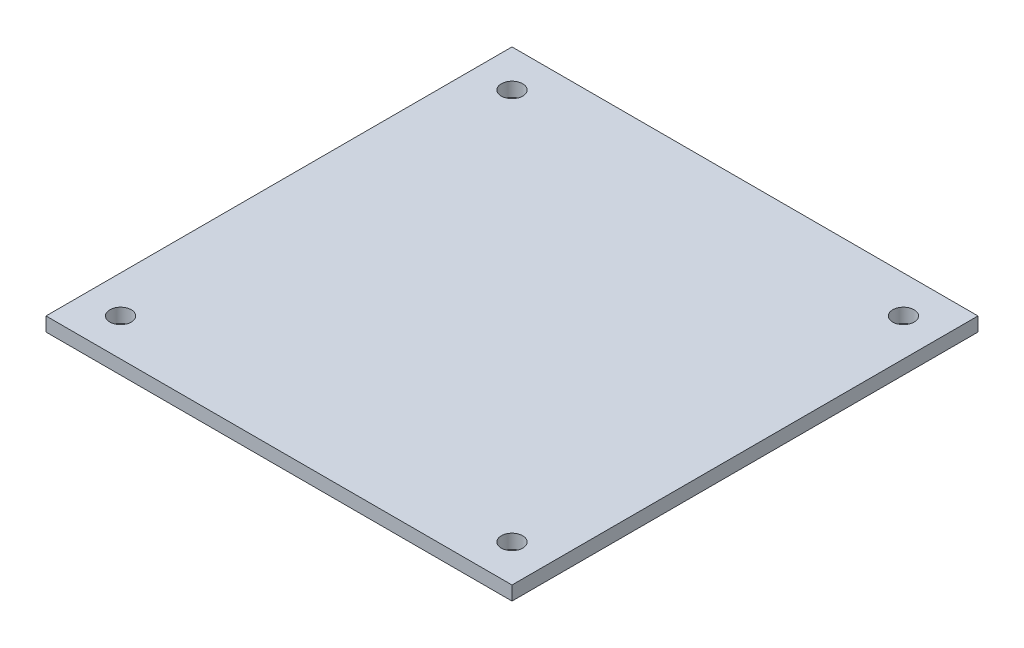
ISO-10303-21;
HEADER;
FILE_DESCRIPTION(('STEP AP214'),'2;1');
FILE_NAME('part.step','',(''),(''),'','','');
FILE_SCHEMA(('AUTOMOTIVE_DESIGN { 1 0 10303 214 1 1 1 1 }'));
ENDSEC;
DATA;
#1=APPLICATION_CONTEXT('core data for automotive mechanical design processes');
#2=APPLICATION_PROTOCOL_DEFINITION('international standard','automotive_design',2000,#1);
#3=PRODUCT_CONTEXT('',#1,'mechanical');
#4=PRODUCT('Part','Part','',(#3));
#5=PRODUCT_RELATED_PRODUCT_CATEGORY('part','',(#4));
#6=PRODUCT_DEFINITION_FORMATION('','',#4);
#7=PRODUCT_DEFINITION_CONTEXT('part definition',#1,'design');
#8=PRODUCT_DEFINITION('design','',#6,#7);
#9=PRODUCT_DEFINITION_SHAPE('','',#8);
#10=(LENGTH_UNIT() NAMED_UNIT(*) SI_UNIT(.MILLI.,.METRE.));
#11=(NAMED_UNIT(*) PLANE_ANGLE_UNIT() SI_UNIT($,.RADIAN.));
#12=(NAMED_UNIT(*) SI_UNIT($,.STERADIAN.) SOLID_ANGLE_UNIT());
#13=UNCERTAINTY_MEASURE_WITH_UNIT(LENGTH_MEASURE(1.E-05),#10,'distance_accuracy_value','');
#14=(GEOMETRIC_REPRESENTATION_CONTEXT(3) GLOBAL_UNCERTAINTY_ASSIGNED_CONTEXT((#13)) GLOBAL_UNIT_ASSIGNED_CONTEXT((#10,
#11,#12)) REPRESENTATION_CONTEXT('',''));
#15=CARTESIAN_POINT('',(0.,0.,0.));
#16=DIRECTION('',(0.,0.,1.));
#17=DIRECTION('',(1.,0.,0.));
#18=AXIS2_PLACEMENT_3D('',#15,#16,#17);
#19=CARTESIAN_POINT('',(-49.8904090638348,1.5,-45.5515423866643));
#20=DIRECTION('',(0.,0.,-1.));
#21=DIRECTION('',(-1.,0.,0.));
#22=AXIS2_PLACEMENT_3D('',#19,#20,#21);
#23=PLANE('',#22);
#24=DIRECTION('',(1.,0.,0.));
#25=VECTOR('',#24,1.);
#26=CARTESIAN_POINT('',(-49.8904090638348,0.,-45.5515423866643));
#27=LINE('',#26,#25);
#28=CARTESIAN_POINT('',(-49.8904090638348,0.,-45.5515423866643));
#29=VERTEX_POINT('',#28);
#30=CARTESIAN_POINT('',(0.109590936165201,0.,-45.5515423866643));
#31=VERTEX_POINT('',#30);
#32=EDGE_CURVE('E101',#29,#31,#27,.T.);
#33=ORIENTED_EDGE('',*,*,#32,.F.);
#34=DIRECTION('',(0.,-1.,0.));
#35=VECTOR('',#34,1.);
#36=CARTESIAN_POINT('',(-49.8904090638348,1.5,-45.5515423866643));
#37=LINE('',#36,#35);
#38=CARTESIAN_POINT('',(-49.8904090638348,1.5,-45.5515423866643));
#39=VERTEX_POINT('',#38);
#40=EDGE_CURVE('E11',#39,#29,#37,.T.);
#41=ORIENTED_EDGE('',*,*,#40,.F.);
#42=DIRECTION('',(1.,0.,0.));
#43=VECTOR('',#42,1.);
#44=CARTESIAN_POINT('',(-49.8904090638348,1.5,-45.5515423866643));
#45=LINE('',#44,#43);
#46=CARTESIAN_POINT('',(0.109590936165201,1.5,-45.5515423866643));
#47=VERTEX_POINT('',#46);
#48=EDGE_CURVE('E95',#39,#47,#45,.T.);
#49=ORIENTED_EDGE('',*,*,#48,.T.);
#50=DIRECTION('',(0.,-1.,0.));
#51=VECTOR('',#50,1.);
#52=CARTESIAN_POINT('',(0.109590936165201,1.5,-45.5515423866643));
#53=LINE('',#52,#51);
#54=EDGE_CURVE('E38',#47,#31,#53,.T.);
#55=ORIENTED_EDGE('',*,*,#54,.T.);
#56=EDGE_LOOP('',(#33,#41,#49,#55));
#57=FACE_BOUND('',#56,.T.);
#58=ADVANCED_FACE('F35',(#57),#23,.T.);
#59=CARTESIAN_POINT('',(-49.8904090638348,1.5,-45.5515423866643));
#60=DIRECTION('',(1.,0.,0.));
#61=DIRECTION('',(0.,0.,-1.));
#62=AXIS2_PLACEMENT_3D('',#59,#60,#61);
#63=PLANE('',#62);
#64=DIRECTION('',(0.,0.,1.));
#65=VECTOR('',#64,1.);
#66=CARTESIAN_POINT('',(-49.8904090638348,0.,-45.5515423866643));
#67=LINE('',#66,#65);
#68=CARTESIAN_POINT('',(-49.8904090638348,0.,4.44845761333568));
#69=VERTEX_POINT('',#68);
#70=EDGE_CURVE('E68',#29,#69,#67,.T.);
#71=ORIENTED_EDGE('',*,*,#70,.T.);
#72=DIRECTION('',(0.,-1.,0.));
#73=VECTOR('',#72,1.);
#74=CARTESIAN_POINT('',(-49.8904090638348,1.5,4.44845761333568));
#75=LINE('',#74,#73);
#76=CARTESIAN_POINT('',(-49.8904090638348,1.5,4.44845761333568));
#77=VERTEX_POINT('',#76);
#78=EDGE_CURVE('E44',#77,#69,#75,.T.);
#79=ORIENTED_EDGE('',*,*,#78,.F.);
#80=DIRECTION('',(0.,0.,1.));
#81=VECTOR('',#80,1.);
#82=CARTESIAN_POINT('',(-49.8904090638348,1.5,-45.5515423866643));
#83=LINE('',#82,#81);
#84=EDGE_CURVE('E85',#39,#77,#83,.T.);
#85=ORIENTED_EDGE('',*,*,#84,.F.);
#86=ORIENTED_EDGE('',*,*,#40,.T.);
#87=EDGE_LOOP('',(#71,#79,#85,#86));
#88=FACE_BOUND('',#87,.T.);
#89=ADVANCED_FACE('F112',(#88),#63,.F.);
#90=CARTESIAN_POINT('',(-49.8904090638348,1.5,4.44845761333568));
#91=DIRECTION('',(0.,0.,-1.));
#92=DIRECTION('',(-1.,0.,0.));
#93=AXIS2_PLACEMENT_3D('',#90,#91,#92);
#94=PLANE('',#93);
#95=DIRECTION('',(1.,0.,0.));
#96=VECTOR('',#95,1.);
#97=CARTESIAN_POINT('',(-49.8904090638348,0.,4.44845761333568));
#98=LINE('',#97,#96);
#99=CARTESIAN_POINT('',(0.109590936165208,0.,4.44845761333568));
#100=VERTEX_POINT('',#99);
#101=EDGE_CURVE('E92',#69,#100,#98,.T.);
#102=ORIENTED_EDGE('',*,*,#101,.T.);
#103=DIRECTION('',(0.,-1.,0.));
#104=VECTOR('',#103,1.);
#105=CARTESIAN_POINT('',(0.109590936165208,1.5,4.44845761333568));
#106=LINE('',#105,#104);
#107=CARTESIAN_POINT('',(0.109590936165208,1.5,4.44845761333568));
#108=VERTEX_POINT('',#107);
#109=EDGE_CURVE('E89',#108,#100,#106,.T.);
#110=ORIENTED_EDGE('',*,*,#109,.F.);
#111=DIRECTION('',(1.,0.,0.));
#112=VECTOR('',#111,1.);
#113=CARTESIAN_POINT('',(-49.8904090638348,1.5,4.44845761333568));
#114=LINE('',#113,#112);
#115=EDGE_CURVE('E80',#77,#108,#114,.T.);
#116=ORIENTED_EDGE('',*,*,#115,.F.);
#117=ORIENTED_EDGE('',*,*,#78,.T.);
#118=EDGE_LOOP('',(#102,#110,#116,#117));
#119=FACE_BOUND('',#118,.T.);
#120=ADVANCED_FACE('F90',(#119),#94,.F.);
#121=CARTESIAN_POINT('',(0.109590936165201,1.5,-45.5515423866643));
#122=DIRECTION('',(1.,0.,0.));
#123=DIRECTION('',(0.,0.,-1.));
#124=AXIS2_PLACEMENT_3D('',#121,#122,#123);
#125=PLANE('',#124);
#126=DIRECTION('',(0.,0.,1.));
#127=VECTOR('',#126,1.);
#128=CARTESIAN_POINT('',(0.109590936165201,0.,-45.5515423866643));
#129=LINE('',#128,#127);
#130=EDGE_CURVE('E104',#31,#100,#129,.T.);
#131=ORIENTED_EDGE('',*,*,#130,.F.);
#132=ORIENTED_EDGE('',*,*,#54,.F.);
#133=DIRECTION('',(0.,0.,1.));
#134=VECTOR('',#133,1.);
#135=CARTESIAN_POINT('',(0.109590936165201,1.5,-45.5515423866643));
#136=LINE('',#135,#134);
#137=EDGE_CURVE('E84',#47,#108,#136,.T.);
#138=ORIENTED_EDGE('',*,*,#137,.T.);
#139=ORIENTED_EDGE('',*,*,#109,.T.);
#140=EDGE_LOOP('',(#131,#132,#138,#139));
#141=FACE_BOUND('',#140,.T.);
#142=ADVANCED_FACE('F94',(#141),#125,.T.);
#143=CARTESIAN_POINT('',(0.,1.5,0.));
#144=DIRECTION('',(0.,-1.,0.));
#145=DIRECTION('',(0.,0.,-1.));
#146=AXIS2_PLACEMENT_3D('',#143,#144,#145);
#147=PLANE('',#146);
#148=CARTESIAN_POINT('',(-3.8904090638348,1.5,-41.5515423866643));
#149=DIRECTION('',(0.,1.,0.));
#150=DIRECTION('',(0.,0.,1.));
#151=AXIS2_PLACEMENT_3D('',#148,#149,#150);
#152=CIRCLE('',#151,1.15);
#153=CARTESIAN_POINT('',(-3.8904090638348,1.5,-40.4015423866643));
#154=VERTEX_POINT('',#153);
#155=EDGE_CURVE('E173',#154,#154,#152,.T.);
#156=ORIENTED_EDGE('',*,*,#155,.F.);
#157=EDGE_LOOP('',(#156));
#158=FACE_BOUND('',#157,.T.);
#159=CARTESIAN_POINT('',(-45.8904090638348,1.5,-41.5515423866643));
#160=DIRECTION('',(0.,1.,0.));
#161=DIRECTION('',(0.,0.,1.));
#162=AXIS2_PLACEMENT_3D('',#159,#160,#161);
#163=CIRCLE('',#162,1.15);
#164=CARTESIAN_POINT('',(-45.8904090638348,1.5,-40.4015423866643));
#165=VERTEX_POINT('',#164);
#166=EDGE_CURVE('E165',#165,#165,#163,.T.);
#167=ORIENTED_EDGE('',*,*,#166,.F.);
#168=EDGE_LOOP('',(#167));
#169=FACE_BOUND('',#168,.T.);
#170=CARTESIAN_POINT('',(-45.8904090638348,1.5,0.448457613335673));
#171=DIRECTION('',(0.,1.,0.));
#172=DIRECTION('',(0.,0.,1.));
#173=AXIS2_PLACEMENT_3D('',#170,#171,#172);
#174=CIRCLE('',#173,1.15);
#175=CARTESIAN_POINT('',(-45.8904090638348,1.5,1.59845761333567));
#176=VERTEX_POINT('',#175);
#177=EDGE_CURVE('E158',#176,#176,#174,.T.);
#178=ORIENTED_EDGE('',*,*,#177,.F.);
#179=EDGE_LOOP('',(#178));
#180=FACE_BOUND('',#179,.T.);
#181=CARTESIAN_POINT('',(-3.8904090638348,1.5,0.448457613335673));
#182=DIRECTION('',(0.,1.,0.));
#183=DIRECTION('',(0.,0.,1.));
#184=AXIS2_PLACEMENT_3D('',#181,#182,#183);
#185=CIRCLE('',#184,1.15);
#186=CARTESIAN_POINT('',(-3.8904090638348,1.5,1.59845761333567));
#187=VERTEX_POINT('',#186);
#188=EDGE_CURVE('E162',#187,#187,#185,.T.);
#189=ORIENTED_EDGE('',*,*,#188,.F.);
#190=EDGE_LOOP('',(#189));
#191=FACE_BOUND('',#190,.T.);
#192=ORIENTED_EDGE('',*,*,#48,.F.);
#193=ORIENTED_EDGE('',*,*,#84,.T.);
#194=ORIENTED_EDGE('',*,*,#115,.T.);
#195=ORIENTED_EDGE('',*,*,#137,.F.);
#196=EDGE_LOOP('',(#192,#193,#194,#195));
#197=FACE_BOUND('',#196,.T.);
#198=ADVANCED_FACE('F83',(#158,#169,#180,#191,#197),#147,.F.);
#199=CARTESIAN_POINT('',(0.,0.,0.));
#200=DIRECTION('',(0.,-1.,0.));
#201=DIRECTION('',(0.,0.,-1.));
#202=AXIS2_PLACEMENT_3D('',#199,#200,#201);
#203=PLANE('',#202);
#204=CARTESIAN_POINT('',(-3.8904090638348,0.,-41.5515423866643));
#205=DIRECTION('',(0.,1.,0.));
#206=DIRECTION('',(0.,0.,1.));
#207=AXIS2_PLACEMENT_3D('',#204,#205,#206);
#208=CIRCLE('',#207,1.15);
#209=CARTESIAN_POINT('',(-3.8904090638348,0.,-40.4015423866643));
#210=VERTEX_POINT('',#209);
#211=EDGE_CURVE('E170',#210,#210,#208,.T.);
#212=ORIENTED_EDGE('',*,*,#211,.T.);
#213=EDGE_LOOP('',(#212));
#214=FACE_BOUND('',#213,.T.);
#215=CARTESIAN_POINT('',(-45.8904090638348,0.,-41.5515423866643));
#216=DIRECTION('',(0.,1.,0.));
#217=DIRECTION('',(0.,0.,1.));
#218=AXIS2_PLACEMENT_3D('',#215,#216,#217);
#219=CIRCLE('',#218,1.15);
#220=CARTESIAN_POINT('',(-45.8904090638348,0.,-40.4015423866643));
#221=VERTEX_POINT('',#220);
#222=EDGE_CURVE('E160',#221,#221,#219,.T.);
#223=ORIENTED_EDGE('',*,*,#222,.T.);
#224=EDGE_LOOP('',(#223));
#225=FACE_BOUND('',#224,.T.);
#226=CARTESIAN_POINT('',(-45.8904090638348,0.,0.448457613335673));
#227=DIRECTION('',(0.,1.,0.));
#228=DIRECTION('',(0.,0.,1.));
#229=AXIS2_PLACEMENT_3D('',#226,#227,#228);
#230=CIRCLE('',#229,1.15);
#231=CARTESIAN_POINT('',(-45.8904090638348,0.,1.59845761333567));
#232=VERTEX_POINT('',#231);
#233=EDGE_CURVE('E155',#232,#232,#230,.T.);
#234=ORIENTED_EDGE('',*,*,#233,.T.);
#235=EDGE_LOOP('',(#234));
#236=FACE_BOUND('',#235,.T.);
#237=CARTESIAN_POINT('',(-3.8904090638348,0.,0.448457613335673));
#238=DIRECTION('',(0.,1.,0.));
#239=DIRECTION('',(0.,0.,1.));
#240=AXIS2_PLACEMENT_3D('',#237,#238,#239);
#241=CIRCLE('',#240,1.15);
#242=CARTESIAN_POINT('',(-3.8904090638348,0.,1.59845761333567));
#243=VERTEX_POINT('',#242);
#244=EDGE_CURVE('E105',#243,#243,#241,.T.);
#245=ORIENTED_EDGE('',*,*,#244,.T.);
#246=EDGE_LOOP('',(#245));
#247=FACE_BOUND('',#246,.T.);
#248=ORIENTED_EDGE('',*,*,#32,.T.);
#249=ORIENTED_EDGE('',*,*,#130,.T.);
#250=ORIENTED_EDGE('',*,*,#101,.F.);
#251=ORIENTED_EDGE('',*,*,#70,.F.);
#252=EDGE_LOOP('',(#248,#249,#250,#251));
#253=FACE_BOUND('',#252,.T.);
#254=ADVANCED_FACE('F110',(#214,#225,#236,#247,#253),#203,.T.);
#255=CARTESIAN_POINT('',(-3.8904090638348,0.,0.448457613335673));
#256=DIRECTION('',(0.,1.,0.));
#257=DIRECTION('',(0.,0.,1.));
#258=AXIS2_PLACEMENT_3D('',#255,#256,#257);
#259=CYLINDRICAL_SURFACE('',#258,1.15);
#260=ORIENTED_EDGE('',*,*,#244,.F.);
#261=EDGE_LOOP('',(#260));
#262=FACE_BOUND('',#261,.T.);
#263=ORIENTED_EDGE('',*,*,#188,.T.);
#264=EDGE_LOOP('',(#263));
#265=FACE_BOUND('',#264,.T.);
#266=ADVANCED_FACE('F131',(#262,#265),#259,.F.);
#267=CARTESIAN_POINT('',(-45.8904090638348,0.,0.448457613335673));
#268=DIRECTION('',(0.,1.,0.));
#269=DIRECTION('',(0.,0.,1.));
#270=AXIS2_PLACEMENT_3D('',#267,#268,#269);
#271=CYLINDRICAL_SURFACE('',#270,1.15);
#272=ORIENTED_EDGE('',*,*,#233,.F.);
#273=EDGE_LOOP('',(#272));
#274=FACE_BOUND('',#273,.T.);
#275=ORIENTED_EDGE('',*,*,#177,.T.);
#276=EDGE_LOOP('',(#275));
#277=FACE_BOUND('',#276,.T.);
#278=ADVANCED_FACE('F138',(#274,#277),#271,.F.);
#279=CARTESIAN_POINT('',(-45.8904090638348,0.,-41.5515423866643));
#280=DIRECTION('',(0.,1.,0.));
#281=DIRECTION('',(0.,0.,1.));
#282=AXIS2_PLACEMENT_3D('',#279,#280,#281);
#283=CYLINDRICAL_SURFACE('',#282,1.15);
#284=ORIENTED_EDGE('',*,*,#222,.F.);
#285=EDGE_LOOP('',(#284));
#286=FACE_BOUND('',#285,.T.);
#287=ORIENTED_EDGE('',*,*,#166,.T.);
#288=EDGE_LOOP('',(#287));
#289=FACE_BOUND('',#288,.T.);
#290=ADVANCED_FACE('F143',(#286,#289),#283,.F.);
#291=CARTESIAN_POINT('',(-3.8904090638348,0.,-41.5515423866643));
#292=DIRECTION('',(0.,1.,0.));
#293=DIRECTION('',(0.,0.,1.));
#294=AXIS2_PLACEMENT_3D('',#291,#292,#293);
#295=CYLINDRICAL_SURFACE('',#294,1.15);
#296=ORIENTED_EDGE('',*,*,#211,.F.);
#297=EDGE_LOOP('',(#296));
#298=FACE_BOUND('',#297,.T.);
#299=ORIENTED_EDGE('',*,*,#155,.T.);
#300=EDGE_LOOP('',(#299));
#301=FACE_BOUND('',#300,.T.);
#302=ADVANCED_FACE('F140',(#298,#301),#295,.F.);
#303=CLOSED_SHELL('',(#58,#89,#120,#142,#198,#254,#266,#278,#290,#302));
#304=MANIFOLD_SOLID_BREP('B2',#303);
#305=ADVANCED_BREP_SHAPE_REPRESENTATION('',(#18,#304),#14);
#306=SHAPE_DEFINITION_REPRESENTATION(#9,#305);
ENDSEC;
END-ISO-10303-21;
